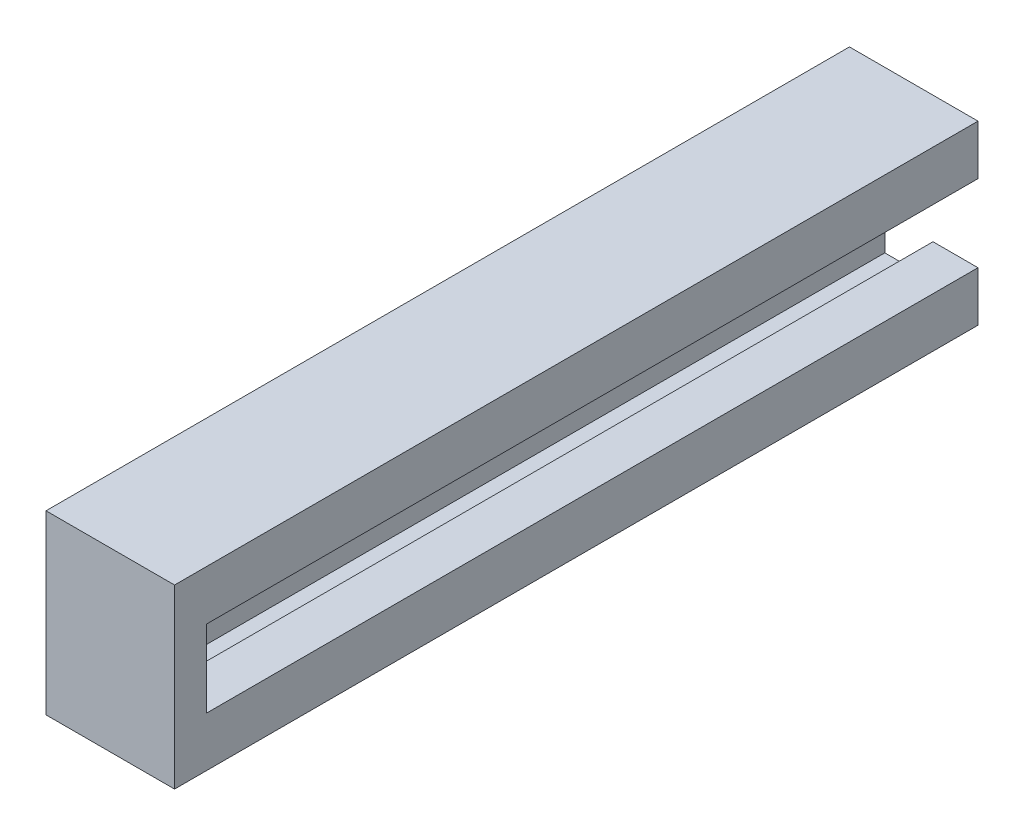
ISO-10303-21;
HEADER;
FILE_DESCRIPTION(('STEP AP214'),'2;1');
FILE_NAME('part.step','',(''),(''),'','','');
FILE_SCHEMA(('AUTOMOTIVE_DESIGN { 1 0 10303 214 1 1 1 1 }'));
ENDSEC;
DATA;
#1=APPLICATION_CONTEXT('core data for automotive mechanical design processes');
#2=APPLICATION_PROTOCOL_DEFINITION('international standard','automotive_design',2000,#1);
#3=PRODUCT_CONTEXT('',#1,'mechanical');
#4=PRODUCT('Part','Part','',(#3));
#5=PRODUCT_RELATED_PRODUCT_CATEGORY('part','',(#4));
#6=PRODUCT_DEFINITION_FORMATION('','',#4);
#7=PRODUCT_DEFINITION_CONTEXT('part definition',#1,'design');
#8=PRODUCT_DEFINITION('design','',#6,#7);
#9=PRODUCT_DEFINITION_SHAPE('','',#8);
#10=(LENGTH_UNIT() NAMED_UNIT(*) SI_UNIT(.MILLI.,.METRE.));
#11=(NAMED_UNIT(*) PLANE_ANGLE_UNIT() SI_UNIT($,.RADIAN.));
#12=(NAMED_UNIT(*) SI_UNIT($,.STERADIAN.) SOLID_ANGLE_UNIT());
#13=UNCERTAINTY_MEASURE_WITH_UNIT(LENGTH_MEASURE(1.E-05),#10,'distance_accuracy_value','');
#14=(GEOMETRIC_REPRESENTATION_CONTEXT(3) GLOBAL_UNCERTAINTY_ASSIGNED_CONTEXT((#13)) GLOBAL_UNIT_ASSIGNED_CONTEXT((#10,
#11,#12)) REPRESENTATION_CONTEXT('',''));
#15=CARTESIAN_POINT('',(0.,0.,0.));
#16=DIRECTION('',(0.,0.,1.));
#17=DIRECTION('',(1.,0.,0.));
#18=AXIS2_PLACEMENT_3D('',#15,#16,#17);
#19=CARTESIAN_POINT('',(-11.5747368421052,-21.1852631578947,120.));
#20=DIRECTION('',(1.,0.,0.));
#21=DIRECTION('',(0.,1.,0.));
#22=AXIS2_PLACEMENT_3D('',#19,#20,#21);
#23=PLANE('',#22);
#24=DIRECTION('',(0.,-1.,0.));
#25=VECTOR('',#24,1.);
#26=CARTESIAN_POINT('',(-11.5747368421052,-21.1852631578947,0.));
#27=LINE('',#26,#25);
#28=CARTESIAN_POINT('',(-11.5747368421052,6.31473684210526,0.));
#29=VERTEX_POINT('',#28);
#30=CARTESIAN_POINT('',(-11.5747368421052,-21.1852631578947,0.));
#31=VERTEX_POINT('',#30);
#32=EDGE_CURVE('E161',#29,#31,#27,.T.);
#33=ORIENTED_EDGE('',*,*,#32,.T.);
#34=DIRECTION('',(0.,0.,-1.));
#35=VECTOR('',#34,1.);
#36=CARTESIAN_POINT('',(-11.5747368421052,-21.1852631578947,120.));
#37=LINE('',#36,#35);
#38=CARTESIAN_POINT('',(-11.5747368421052,-21.1852631578947,125.));
#39=VERTEX_POINT('',#38);
#40=EDGE_CURVE('E11',#39,#31,#37,.T.);
#41=ORIENTED_EDGE('',*,*,#40,.F.);
#42=DIRECTION('',(0.,-1.,0.));
#43=VECTOR('',#42,1.);
#44=CARTESIAN_POINT('',(-11.5747368421052,6.31473684210526,125.));
#45=LINE('',#44,#43);
#46=CARTESIAN_POINT('',(-11.5747368421052,6.31473684210526,125.));
#47=VERTEX_POINT('',#46);
#48=EDGE_CURVE('E227',#47,#39,#45,.T.);
#49=ORIENTED_EDGE('',*,*,#48,.F.);
#50=DIRECTION('',(0.,0.,-1.));
#51=VECTOR('',#50,1.);
#52=CARTESIAN_POINT('',(-11.5747368421052,6.31473684210526,120.));
#53=LINE('',#52,#51);
#54=EDGE_CURVE('E160',#47,#29,#53,.T.);
#55=ORIENTED_EDGE('',*,*,#54,.T.);
#56=EDGE_LOOP('',(#33,#41,#49,#55));
#57=FACE_BOUND('',#56,.T.);
#58=ADVANCED_FACE('F36',(#57),#23,.F.);
#59=CARTESIAN_POINT('',(8.42526315789476,-21.1852631578947,120.));
#60=DIRECTION('',(0.,1.,0.));
#61=DIRECTION('',(-1.,0.,0.));
#62=AXIS2_PLACEMENT_3D('',#59,#60,#61);
#63=PLANE('',#62);
#64=DIRECTION('',(1.,0.,0.));
#65=VECTOR('',#64,1.);
#66=CARTESIAN_POINT('',(8.42526315789476,-21.1852631578947,0.));
#67=LINE('',#66,#65);
#68=CARTESIAN_POINT('',(8.42526315789476,-21.1852631578947,0.));
#69=VERTEX_POINT('',#68);
#70=EDGE_CURVE('E164',#31,#69,#67,.T.);
#71=ORIENTED_EDGE('',*,*,#70,.T.);
#72=DIRECTION('',(0.,0.,-1.));
#73=VECTOR('',#72,1.);
#74=CARTESIAN_POINT('',(8.42526315789476,-21.1852631578947,120.));
#75=LINE('',#74,#73);
#76=CARTESIAN_POINT('',(8.42526315789476,-21.1852631578947,125.));
#77=VERTEX_POINT('',#76);
#78=EDGE_CURVE('E44',#77,#69,#75,.T.);
#79=ORIENTED_EDGE('',*,*,#78,.F.);
#80=DIRECTION('',(1.,0.,0.));
#81=VECTOR('',#80,1.);
#82=CARTESIAN_POINT('',(8.42526315789476,-21.1852631578947,125.));
#83=LINE('',#82,#81);
#84=EDGE_CURVE('E165',#39,#77,#83,.T.);
#85=ORIENTED_EDGE('',*,*,#84,.F.);
#86=ORIENTED_EDGE('',*,*,#40,.T.);
#87=EDGE_LOOP('',(#71,#79,#85,#86));
#88=FACE_BOUND('',#87,.T.);
#89=ADVANCED_FACE('F261',(#88),#63,.F.);
#90=CARTESIAN_POINT('',(1.42526315789476,-13.4352631578947,120.));
#91=DIRECTION('',(0.,-1.,0.));
#92=DIRECTION('',(0.,0.,-1.));
#93=AXIS2_PLACEMENT_3D('',#90,#91,#92);
#94=PLANE('',#93);
#95=DIRECTION('',(-1.,0.,0.));
#96=VECTOR('',#95,1.);
#97=CARTESIAN_POINT('',(1.42526315789476,-13.4352631578947,0.));
#98=LINE('',#97,#96);
#99=CARTESIAN_POINT('',(8.42526315789476,-13.4352631578947,0.));
#100=VERTEX_POINT('',#99);
#101=CARTESIAN_POINT('',(1.42526315789476,-13.4352631578947,0.));
#102=VERTEX_POINT('',#101);
#103=EDGE_CURVE('E169',#100,#102,#98,.T.);
#104=ORIENTED_EDGE('',*,*,#103,.T.);
#105=DIRECTION('',(0.,0.,-1.));
#106=VECTOR('',#105,1.);
#107=CARTESIAN_POINT('',(1.42526315789476,-13.4352631578947,120.));
#108=LINE('',#107,#106);
#109=CARTESIAN_POINT('',(1.42526315789476,-13.4352631578947,120.));
#110=VERTEX_POINT('',#109);
#111=EDGE_CURVE('E196',#110,#102,#108,.T.);
#112=ORIENTED_EDGE('',*,*,#111,.F.);
#113=DIRECTION('',(-1.,0.,0.));
#114=VECTOR('',#113,1.);
#115=CARTESIAN_POINT('',(1.42526315789476,-13.4352631578947,120.));
#116=LINE('',#115,#114);
#117=CARTESIAN_POINT('',(8.42526315789476,-13.4352631578947,120.));
#118=VERTEX_POINT('',#117);
#119=EDGE_CURVE('E184',#118,#110,#116,.T.);
#120=ORIENTED_EDGE('',*,*,#119,.F.);
#121=DIRECTION('',(0.,0.,-1.));
#122=VECTOR('',#121,1.);
#123=CARTESIAN_POINT('',(8.42526315789476,-13.4352631578947,120.));
#124=LINE('',#123,#122);
#125=EDGE_CURVE('E108',#118,#100,#124,.T.);
#126=ORIENTED_EDGE('',*,*,#125,.T.);
#127=EDGE_LOOP('',(#104,#112,#120,#126));
#128=FACE_BOUND('',#127,.T.);
#129=ADVANCED_FACE('F217',(#128),#94,.F.);
#130=CARTESIAN_POINT('',(1.42526315789476,-18.6852631578947,120.));
#131=DIRECTION('',(1.,0.,0.));
#132=DIRECTION('',(0.,0.,-1.));
#133=AXIS2_PLACEMENT_3D('',#130,#131,#132);
#134=PLANE('',#133);
#135=DIRECTION('',(0.,-1.,0.));
#136=VECTOR('',#135,1.);
#137=CARTESIAN_POINT('',(1.42526315789476,-18.6852631578947,0.));
#138=LINE('',#137,#136);
#139=CARTESIAN_POINT('',(1.42526315789476,-18.6852631578947,0.));
#140=VERTEX_POINT('',#139);
#141=EDGE_CURVE('E171',#102,#140,#138,.T.);
#142=ORIENTED_EDGE('',*,*,#141,.T.);
#143=DIRECTION('',(0.,0.,-1.));
#144=VECTOR('',#143,1.);
#145=CARTESIAN_POINT('',(1.42526315789476,-18.6852631578947,120.));
#146=LINE('',#145,#144);
#147=CARTESIAN_POINT('',(1.42526315789476,-18.6852631578947,120.));
#148=VERTEX_POINT('',#147);
#149=EDGE_CURVE('E193',#148,#140,#146,.T.);
#150=ORIENTED_EDGE('',*,*,#149,.F.);
#151=DIRECTION('',(0.,-1.,0.));
#152=VECTOR('',#151,1.);
#153=CARTESIAN_POINT('',(1.42526315789476,-18.6852631578947,120.));
#154=LINE('',#153,#152);
#155=EDGE_CURVE('E152',#110,#148,#154,.T.);
#156=ORIENTED_EDGE('',*,*,#155,.F.);
#157=ORIENTED_EDGE('',*,*,#111,.T.);
#158=EDGE_LOOP('',(#142,#150,#156,#157));
#159=FACE_BOUND('',#158,.T.);
#160=ADVANCED_FACE('F220',(#159),#134,.F.);
#161=CARTESIAN_POINT('',(-6.07473684210524,-18.6852631578947,120.));
#162=DIRECTION('',(0.,-1.,0.));
#163=DIRECTION('',(0.,0.,-1.));
#164=AXIS2_PLACEMENT_3D('',#161,#162,#163);
#165=PLANE('',#164);
#166=DIRECTION('',(-1.,0.,0.));
#167=VECTOR('',#166,1.);
#168=CARTESIAN_POINT('',(-6.07473684210524,-18.6852631578947,0.));
#169=LINE('',#168,#167);
#170=CARTESIAN_POINT('',(-6.07473684210524,-18.6852631578947,0.));
#171=VERTEX_POINT('',#170);
#172=EDGE_CURVE('E173',#140,#171,#169,.T.);
#173=ORIENTED_EDGE('',*,*,#172,.T.);
#174=DIRECTION('',(0.,0.,-1.));
#175=VECTOR('',#174,1.);
#176=CARTESIAN_POINT('',(-6.07473684210524,-18.6852631578947,120.));
#177=LINE('',#176,#175);
#178=CARTESIAN_POINT('',(-6.07473684210524,-18.6852631578947,120.));
#179=VERTEX_POINT('',#178);
#180=EDGE_CURVE('E135',#179,#171,#177,.T.);
#181=ORIENTED_EDGE('',*,*,#180,.F.);
#182=DIRECTION('',(-1.,0.,0.));
#183=VECTOR('',#182,1.);
#184=CARTESIAN_POINT('',(-6.07473684210524,-18.6852631578947,120.));
#185=LINE('',#184,#183);
#186=EDGE_CURVE('E150',#148,#179,#185,.T.);
#187=ORIENTED_EDGE('',*,*,#186,.F.);
#188=ORIENTED_EDGE('',*,*,#149,.T.);
#189=EDGE_LOOP('',(#173,#181,#187,#188));
#190=FACE_BOUND('',#189,.T.);
#191=ADVANCED_FACE('F272',(#190),#165,.F.);
#192=CARTESIAN_POINT('',(-6.07473684210524,3.81473684210526,120.));
#193=DIRECTION('',(-1.,0.,0.));
#194=DIRECTION('',(0.,-1.,0.));
#195=AXIS2_PLACEMENT_3D('',#192,#193,#194);
#196=PLANE('',#195);
#197=DIRECTION('',(0.,1.,0.));
#198=VECTOR('',#197,1.);
#199=CARTESIAN_POINT('',(-6.07473684210524,3.81473684210526,0.));
#200=LINE('',#199,#198);
#201=CARTESIAN_POINT('',(-6.07473684210524,3.81473684210526,0.));
#202=VERTEX_POINT('',#201);
#203=EDGE_CURVE('E132',#171,#202,#200,.T.);
#204=ORIENTED_EDGE('',*,*,#203,.T.);
#205=DIRECTION('',(0.,0.,-1.));
#206=VECTOR('',#205,1.);
#207=CARTESIAN_POINT('',(-6.07473684210524,3.81473684210526,120.));
#208=LINE('',#207,#206);
#209=CARTESIAN_POINT('',(-6.07473684210524,3.81473684210526,120.));
#210=VERTEX_POINT('',#209);
#211=EDGE_CURVE('E124',#210,#202,#208,.T.);
#212=ORIENTED_EDGE('',*,*,#211,.F.);
#213=DIRECTION('',(0.,1.,0.));
#214=VECTOR('',#213,1.);
#215=CARTESIAN_POINT('',(-6.07473684210524,3.81473684210526,120.));
#216=LINE('',#215,#214);
#217=EDGE_CURVE('E129',#179,#210,#216,.T.);
#218=ORIENTED_EDGE('',*,*,#217,.F.);
#219=ORIENTED_EDGE('',*,*,#180,.T.);
#220=EDGE_LOOP('',(#204,#212,#218,#219));
#221=FACE_BOUND('',#220,.T.);
#222=ADVANCED_FACE('F126',(#221),#196,.F.);
#223=CARTESIAN_POINT('',(1.92526315789476,3.81473684210527,120.));
#224=DIRECTION('',(0.,1.,0.));
#225=DIRECTION('',(-1.,0.,0.));
#226=AXIS2_PLACEMENT_3D('',#223,#224,#225);
#227=PLANE('',#226);
#228=DIRECTION('',(1.,0.,0.));
#229=VECTOR('',#228,1.);
#230=CARTESIAN_POINT('',(1.92526315789476,3.81473684210527,0.));
#231=LINE('',#230,#229);
#232=CARTESIAN_POINT('',(1.92526315789476,3.81473684210527,0.));
#233=VERTEX_POINT('',#232);
#234=EDGE_CURVE('E176',#202,#233,#231,.T.);
#235=ORIENTED_EDGE('',*,*,#234,.T.);
#236=DIRECTION('',(0.,0.,-1.));
#237=VECTOR('',#236,1.);
#238=CARTESIAN_POINT('',(1.92526315789476,3.81473684210527,120.));
#239=LINE('',#238,#237);
#240=CARTESIAN_POINT('',(1.92526315789476,3.81473684210527,120.));
#241=VERTEX_POINT('',#240);
#242=EDGE_CURVE('E136',#241,#233,#239,.T.);
#243=ORIENTED_EDGE('',*,*,#242,.F.);
#244=DIRECTION('',(1.,0.,0.));
#245=VECTOR('',#244,1.);
#246=CARTESIAN_POINT('',(1.92526315789476,3.81473684210527,120.));
#247=LINE('',#246,#245);
#248=EDGE_CURVE('E139',#210,#241,#247,.T.);
#249=ORIENTED_EDGE('',*,*,#248,.F.);
#250=ORIENTED_EDGE('',*,*,#211,.T.);
#251=EDGE_LOOP('',(#235,#243,#249,#250));
#252=FACE_BOUND('',#251,.T.);
#253=ADVANCED_FACE('F140',(#252),#227,.F.);
#254=CARTESIAN_POINT('',(1.92526315789476,-1.43526315789474,120.));
#255=DIRECTION('',(1.,0.,0.));
#256=DIRECTION('',(0.,0.,-1.));
#257=AXIS2_PLACEMENT_3D('',#254,#255,#256);
#258=PLANE('',#257);
#259=DIRECTION('',(0.,-1.,0.));
#260=VECTOR('',#259,1.);
#261=CARTESIAN_POINT('',(1.92526315789476,-1.43526315789474,0.));
#262=LINE('',#261,#260);
#263=CARTESIAN_POINT('',(1.92526315789476,-1.43526315789474,0.));
#264=VERTEX_POINT('',#263);
#265=EDGE_CURVE('E178',#233,#264,#262,.T.);
#266=ORIENTED_EDGE('',*,*,#265,.T.);
#267=DIRECTION('',(0.,0.,-1.));
#268=VECTOR('',#267,1.);
#269=CARTESIAN_POINT('',(1.92526315789476,-1.43526315789474,120.));
#270=LINE('',#269,#268);
#271=CARTESIAN_POINT('',(1.92526315789476,-1.43526315789474,120.));
#272=VERTEX_POINT('',#271);
#273=EDGE_CURVE('E52',#272,#264,#270,.T.);
#274=ORIENTED_EDGE('',*,*,#273,.F.);
#275=DIRECTION('',(0.,-1.,0.));
#276=VECTOR('',#275,1.);
#277=CARTESIAN_POINT('',(1.92526315789476,-1.43526315789474,120.));
#278=LINE('',#277,#276);
#279=EDGE_CURVE('E144',#241,#272,#278,.T.);
#280=ORIENTED_EDGE('',*,*,#279,.F.);
#281=ORIENTED_EDGE('',*,*,#242,.T.);
#282=EDGE_LOOP('',(#266,#274,#280,#281));
#283=FACE_BOUND('',#282,.T.);
#284=ADVANCED_FACE('F248',(#283),#258,.F.);
#285=CARTESIAN_POINT('',(8.42526315789476,-1.43526315789473,120.));
#286=DIRECTION('',(0.,1.,0.));
#287=DIRECTION('',(-1.,0.,0.));
#288=AXIS2_PLACEMENT_3D('',#285,#286,#287);
#289=PLANE('',#288);
#290=DIRECTION('',(1.,0.,0.));
#291=VECTOR('',#290,1.);
#292=CARTESIAN_POINT('',(8.42526315789476,-1.43526315789473,0.));
#293=LINE('',#292,#291);
#294=CARTESIAN_POINT('',(8.42526315789476,-1.43526315789473,0.));
#295=VERTEX_POINT('',#294);
#296=EDGE_CURVE('E180',#264,#295,#293,.T.);
#297=ORIENTED_EDGE('',*,*,#296,.T.);
#298=DIRECTION('',(0.,0.,-1.));
#299=VECTOR('',#298,1.);
#300=CARTESIAN_POINT('',(8.42526315789476,-1.43526315789473,120.));
#301=LINE('',#300,#299);
#302=CARTESIAN_POINT('',(8.42526315789476,-1.43526315789473,120.));
#303=VERTEX_POINT('',#302);
#304=EDGE_CURVE('E188',#303,#295,#301,.T.);
#305=ORIENTED_EDGE('',*,*,#304,.F.);
#306=DIRECTION('',(1.,0.,0.));
#307=VECTOR('',#306,1.);
#308=CARTESIAN_POINT('',(8.42526315789476,-1.43526315789473,120.));
#309=LINE('',#308,#307);
#310=EDGE_CURVE('E157',#272,#303,#309,.T.);
#311=ORIENTED_EDGE('',*,*,#310,.F.);
#312=ORIENTED_EDGE('',*,*,#273,.T.);
#313=EDGE_LOOP('',(#297,#305,#311,#312));
#314=FACE_BOUND('',#313,.T.);
#315=ADVANCED_FACE('F246',(#314),#289,.F.);
#316=CARTESIAN_POINT('',(8.42526315789476,6.31473684210526,120.));
#317=DIRECTION('',(-1.,0.,0.));
#318=DIRECTION('',(0.,-1.,0.));
#319=AXIS2_PLACEMENT_3D('',#316,#317,#318);
#320=PLANE('',#319);
#321=DIRECTION('',(0.,1.,0.));
#322=VECTOR('',#321,1.);
#323=CARTESIAN_POINT('',(8.42526315789476,6.31473684210526,0.));
#324=LINE('',#323,#322);
#325=CARTESIAN_POINT('',(8.42526315789476,6.31473684210526,0.));
#326=VERTEX_POINT('',#325);
#327=EDGE_CURVE('E94',#295,#326,#324,.T.);
#328=ORIENTED_EDGE('',*,*,#327,.T.);
#329=DIRECTION('',(0.,0.,-1.));
#330=VECTOR('',#329,1.);
#331=CARTESIAN_POINT('',(8.42526315789476,6.31473684210526,120.));
#332=LINE('',#331,#330);
#333=CARTESIAN_POINT('',(8.42526315789476,6.31473684210526,125.));
#334=VERTEX_POINT('',#333);
#335=EDGE_CURVE('E186',#334,#326,#332,.T.);
#336=ORIENTED_EDGE('',*,*,#335,.F.);
#337=DIRECTION('',(0.,1.,0.));
#338=VECTOR('',#337,1.);
#339=CARTESIAN_POINT('',(8.42526315789476,6.31473684210526,125.));
#340=LINE('',#339,#338);
#341=EDGE_CURVE('E206',#77,#334,#340,.T.);
#342=ORIENTED_EDGE('',*,*,#341,.F.);
#343=ORIENTED_EDGE('',*,*,#78,.T.);
#344=DIRECTION('',(0.,1.,0.));
#345=VECTOR('',#344,1.);
#346=CARTESIAN_POINT('',(8.42526315789476,-13.4352631578947,0.));
#347=LINE('',#346,#345);
#348=EDGE_CURVE('E167',#69,#100,#347,.T.);
#349=ORIENTED_EDGE('',*,*,#348,.T.);
#350=ORIENTED_EDGE('',*,*,#125,.F.);
#351=DIRECTION('',(0.,1.,0.));
#352=VECTOR('',#351,1.);
#353=CARTESIAN_POINT('',(8.42526315789476,6.31473684210526,120.));
#354=LINE('',#353,#352);
#355=EDGE_CURVE('E222',#118,#303,#354,.T.);
#356=ORIENTED_EDGE('',*,*,#355,.T.);
#357=ORIENTED_EDGE('',*,*,#304,.T.);
#358=EDGE_LOOP('',(#328,#336,#342,#343,#349,#350,#356,#357));
#359=FACE_BOUND('',#358,.T.);
#360=ADVANCED_FACE('F203',(#359),#320,.F.);
#361=CARTESIAN_POINT('',(-11.5747368421052,6.31473684210526,120.));
#362=DIRECTION('',(0.,-1.,0.));
#363=DIRECTION('',(1.,0.,0.));
#364=AXIS2_PLACEMENT_3D('',#361,#362,#363);
#365=PLANE('',#364);
#366=DIRECTION('',(-1.,0.,0.));
#367=VECTOR('',#366,1.);
#368=CARTESIAN_POINT('',(-11.5747368421052,6.31473684210526,0.));
#369=LINE('',#368,#367);
#370=EDGE_CURVE('E101',#326,#29,#369,.T.);
#371=ORIENTED_EDGE('',*,*,#370,.T.);
#372=ORIENTED_EDGE('',*,*,#54,.F.);
#373=DIRECTION('',(-1.,0.,0.));
#374=VECTOR('',#373,1.);
#375=CARTESIAN_POINT('',(8.42526315789476,6.31473684210526,125.));
#376=LINE('',#375,#374);
#377=EDGE_CURVE('E230',#334,#47,#376,.T.);
#378=ORIENTED_EDGE('',*,*,#377,.F.);
#379=ORIENTED_EDGE('',*,*,#335,.T.);
#380=EDGE_LOOP('',(#371,#372,#378,#379));
#381=FACE_BOUND('',#380,.T.);
#382=ADVANCED_FACE('F251',(#381),#365,.F.);
#383=CARTESIAN_POINT('',(0.,0.,0.));
#384=DIRECTION('',(0.,0.,-1.));
#385=DIRECTION('',(-1.,0.,0.));
#386=AXIS2_PLACEMENT_3D('',#383,#384,#385);
#387=PLANE('',#386);
#388=ORIENTED_EDGE('',*,*,#32,.F.);
#389=ORIENTED_EDGE('',*,*,#370,.F.);
#390=ORIENTED_EDGE('',*,*,#327,.F.);
#391=ORIENTED_EDGE('',*,*,#296,.F.);
#392=ORIENTED_EDGE('',*,*,#265,.F.);
#393=ORIENTED_EDGE('',*,*,#234,.F.);
#394=ORIENTED_EDGE('',*,*,#203,.F.);
#395=ORIENTED_EDGE('',*,*,#172,.F.);
#396=ORIENTED_EDGE('',*,*,#141,.F.);
#397=ORIENTED_EDGE('',*,*,#103,.F.);
#398=ORIENTED_EDGE('',*,*,#348,.F.);
#399=ORIENTED_EDGE('',*,*,#70,.F.);
#400=EDGE_LOOP('',(#388,#389,#390,#391,#392,#393,#394,#395,#396,#397,#398,#399));
#401=FACE_BOUND('',#400,.T.);
#402=ADVANCED_FACE('F213',(#401),#387,.T.);
#403=CARTESIAN_POINT('',(0.,0.,125.));
#404=DIRECTION('',(0.,0.,-1.));
#405=DIRECTION('',(-1.,0.,0.));
#406=AXIS2_PLACEMENT_3D('',#403,#404,#405);
#407=PLANE('',#406);
#408=ORIENTED_EDGE('',*,*,#341,.T.);
#409=ORIENTED_EDGE('',*,*,#377,.T.);
#410=ORIENTED_EDGE('',*,*,#48,.T.);
#411=ORIENTED_EDGE('',*,*,#84,.T.);
#412=EDGE_LOOP('',(#408,#409,#410,#411));
#413=FACE_BOUND('',#412,.T.);
#414=ADVANCED_FACE('F235',(#413),#407,.F.);
#415=CARTESIAN_POINT('',(0.,0.,120.));
#416=DIRECTION('',(0.,0.,-1.));
#417=DIRECTION('',(-1.,0.,0.));
#418=AXIS2_PLACEMENT_3D('',#415,#416,#417);
#419=PLANE('',#418);
#420=ORIENTED_EDGE('',*,*,#355,.F.);
#421=ORIENTED_EDGE('',*,*,#119,.T.);
#422=ORIENTED_EDGE('',*,*,#155,.T.);
#423=ORIENTED_EDGE('',*,*,#186,.T.);
#424=ORIENTED_EDGE('',*,*,#217,.T.);
#425=ORIENTED_EDGE('',*,*,#248,.T.);
#426=ORIENTED_EDGE('',*,*,#279,.T.);
#427=ORIENTED_EDGE('',*,*,#310,.T.);
#428=EDGE_LOOP('',(#420,#421,#422,#423,#424,#425,#426,#427));
#429=FACE_BOUND('',#428,.T.);
#430=ADVANCED_FACE('F147',(#429),#419,.T.);
#431=CLOSED_SHELL('',(#58,#89,#129,#160,#191,#222,#253,#284,#315,#360,#382,#402,#414,#430));
#432=MANIFOLD_SOLID_BREP('B2',#431);
#433=ADVANCED_BREP_SHAPE_REPRESENTATION('',(#18,#432),#14);
#434=SHAPE_DEFINITION_REPRESENTATION(#9,#433);
ENDSEC;
END-ISO-10303-21;
